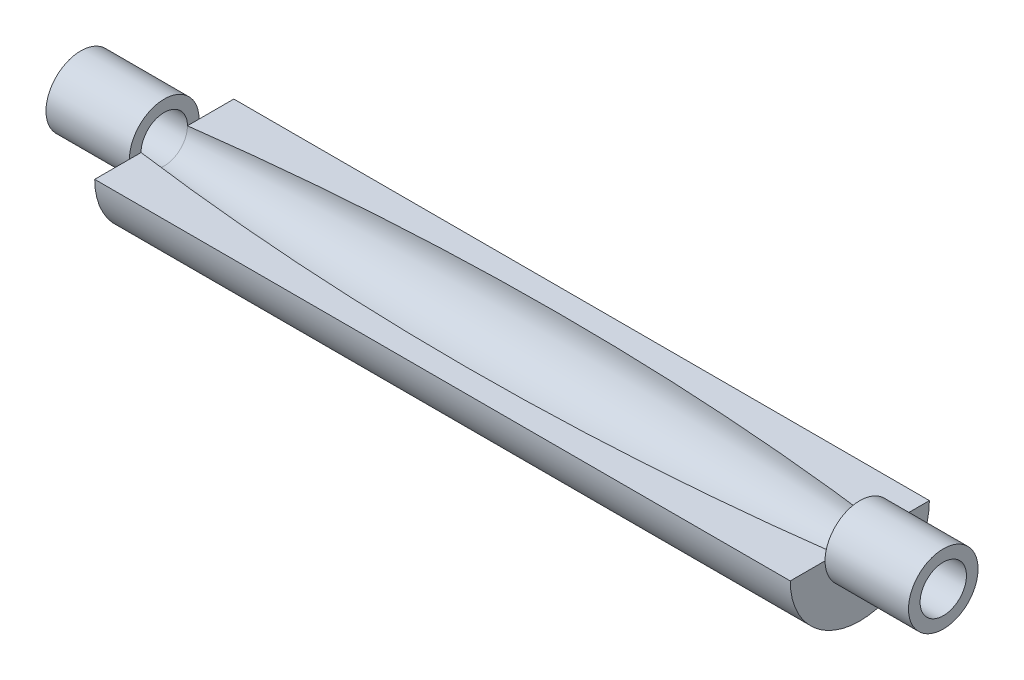
ISO-10303-21;
HEADER;
FILE_DESCRIPTION(('STEP AP214'),'2;1');
FILE_NAME('part.step','',(''),(''),'','','');
FILE_SCHEMA(('AUTOMOTIVE_DESIGN { 1 0 10303 214 1 1 1 1 }'));
ENDSEC;
DATA;
#1=APPLICATION_CONTEXT('core data for automotive mechanical design processes');
#2=APPLICATION_PROTOCOL_DEFINITION('international standard','automotive_design',2000,#1);
#3=PRODUCT_CONTEXT('',#1,'mechanical');
#4=PRODUCT('Part','Part','',(#3));
#5=PRODUCT_RELATED_PRODUCT_CATEGORY('part','',(#4));
#6=PRODUCT_DEFINITION_FORMATION('','',#4);
#7=PRODUCT_DEFINITION_CONTEXT('part definition',#1,'design');
#8=PRODUCT_DEFINITION('design','',#6,#7);
#9=PRODUCT_DEFINITION_SHAPE('','',#8);
#10=(LENGTH_UNIT() NAMED_UNIT(*) SI_UNIT(.MILLI.,.METRE.));
#11=(NAMED_UNIT(*) PLANE_ANGLE_UNIT() SI_UNIT($,.RADIAN.));
#12=(NAMED_UNIT(*) SI_UNIT($,.STERADIAN.) SOLID_ANGLE_UNIT());
#13=UNCERTAINTY_MEASURE_WITH_UNIT(LENGTH_MEASURE(1.E-05),#10,'distance_accuracy_value','');
#14=(GEOMETRIC_REPRESENTATION_CONTEXT(3) GLOBAL_UNCERTAINTY_ASSIGNED_CONTEXT((#13)) GLOBAL_UNIT_ASSIGNED_CONTEXT((#10,
#11,#12)) REPRESENTATION_CONTEXT('',''));
#15=CARTESIAN_POINT('',(0.,0.,0.));
#16=DIRECTION('',(0.,0.,1.));
#17=DIRECTION('',(1.,0.,0.));
#18=AXIS2_PLACEMENT_3D('',#15,#16,#17);
#19=CARTESIAN_POINT('',(-2.08166817117217E-13,-7.75108857223173E-12,1110.));
#20=DIRECTION('',(0.,-1.,0.));
#21=DIRECTION('',(0.,0.,-1.));
#22=AXIS2_PLACEMENT_3D('',#19,#20,#21);
#23=PLANE('',#22);
#24=DIRECTION('',(0.,0.,1.));
#25=VECTOR('',#24,1.);
#26=CARTESIAN_POINT('',(150.,-7.75108857223173E-12,1110.));
#27=LINE('',#26,#25);
#28=CARTESIAN_POINT('',(150.,0.,-15.));
#29=VERTEX_POINT('',#28);
#30=CARTESIAN_POINT('',(150.,0.,-9.99999999999999));
#31=VERTEX_POINT('',#30);
#32=EDGE_CURVE('E98',#29,#31,#27,.T.);
#33=ORIENTED_EDGE('',*,*,#32,.F.);
#34=DIRECTION('',(0.,0.,1.));
#35=VECTOR('',#34,1.);
#36=CARTESIAN_POINT('',(150.,2.09488880330588E-13,-29.9999999999999));
#37=LINE('',#36,#35);
#38=CARTESIAN_POINT('',(150.,2.09488880330588E-13,-29.9999999999999));
#39=VERTEX_POINT('',#38);
#40=EDGE_CURVE('E139',#39,#29,#37,.T.);
#41=ORIENTED_EDGE('',*,*,#40,.F.);
#42=DIRECTION('',(1.,0.,0.));
#43=VECTOR('',#42,1.);
#44=CARTESIAN_POINT('',(-150.,2.09488880330588E-13,-30.));
#45=LINE('',#44,#43);
#46=CARTESIAN_POINT('',(-150.,2.09488880330588E-13,-30.));
#47=VERTEX_POINT('',#46);
#48=EDGE_CURVE('E145',#47,#39,#45,.T.);
#49=ORIENTED_EDGE('',*,*,#48,.F.);
#50=DIRECTION('',(0.,0.,-1.));
#51=VECTOR('',#50,1.);
#52=CARTESIAN_POINT('',(-150.,1.04744440165294E-13,-15.));
#53=LINE('',#52,#51);
#54=CARTESIAN_POINT('',(-150.,1.04744440165294E-13,-15.));
#55=VERTEX_POINT('',#54);
#56=EDGE_CURVE('E230',#55,#47,#53,.T.);
#57=ORIENTED_EDGE('',*,*,#56,.F.);
#58=DIRECTION('',(0.,0.,-1.));
#59=VECTOR('',#58,1.);
#60=CARTESIAN_POINT('',(-150.,-7.75108857223173E-12,1110.));
#61=LINE('',#60,#59);
#62=CARTESIAN_POINT('',(-150.,0.,-9.99999999999999));
#63=VERTEX_POINT('',#62);
#64=EDGE_CURVE('E135',#63,#55,#61,.T.);
#65=ORIENTED_EDGE('',*,*,#64,.F.);
#66=CARTESIAN_POINT('',(-2.08166817117217E-13,-7.75108857223173E-12,1110.));
#67=DIRECTION('',(0.,1.,0.));
#68=DIRECTION('',(0.,0.,-1.));
#69=AXIS2_PLACEMENT_3D('',#66,#67,#68);
#70=CIRCLE('',#69,1130.);
#71=EDGE_CURVE('E125',#31,#63,#70,.T.);
#72=ORIENTED_EDGE('',*,*,#71,.F.);
#73=EDGE_LOOP('',(#33,#41,#49,#57,#65,#72));
#74=FACE_BOUND('',#73,.T.);
#75=ADVANCED_FACE('F43',(#74),#23,.F.);
#76=CARTESIAN_POINT('',(-2.08166817117217E-13,0.,-1110.));
#77=DIRECTION('',(0.,1.,0.));
#78=DIRECTION('',(0.,0.,1.));
#79=AXIS2_PLACEMENT_3D('',#76,#77,#78);
#80=PLANE('',#79);
#81=DIRECTION('',(0.,0.,-1.));
#82=VECTOR('',#81,1.);
#83=CARTESIAN_POINT('',(150.,0.,29.9999999999999));
#84=LINE('',#83,#82);
#85=CARTESIAN_POINT('',(150.,0.,29.9999999999999));
#86=VERTEX_POINT('',#85);
#87=CARTESIAN_POINT('',(150.,0.,15.));
#88=VERTEX_POINT('',#87);
#89=EDGE_CURVE('E223',#86,#88,#84,.T.);
#90=ORIENTED_EDGE('',*,*,#89,.T.);
#91=DIRECTION('',(0.,0.,-1.));
#92=VECTOR('',#91,1.);
#93=CARTESIAN_POINT('',(150.,0.,-1110.));
#94=LINE('',#93,#92);
#95=CARTESIAN_POINT('',(150.,0.,10.));
#96=VERTEX_POINT('',#95);
#97=EDGE_CURVE('E111',#88,#96,#94,.T.);
#98=ORIENTED_EDGE('',*,*,#97,.T.);
#99=CARTESIAN_POINT('',(-2.08166817117217E-13,0.,-1110.));
#100=DIRECTION('',(0.,-1.,0.));
#101=DIRECTION('',(0.,0.,1.));
#102=AXIS2_PLACEMENT_3D('',#99,#100,#101);
#103=CIRCLE('',#102,1130.);
#104=CARTESIAN_POINT('',(-150.,0.,10.));
#105=VERTEX_POINT('',#104);
#106=EDGE_CURVE('E127',#96,#105,#103,.T.);
#107=ORIENTED_EDGE('',*,*,#106,.T.);
#108=DIRECTION('',(0.,0.,1.));
#109=VECTOR('',#108,1.);
#110=CARTESIAN_POINT('',(-150.,0.,-1110.));
#111=LINE('',#110,#109);
#112=CARTESIAN_POINT('',(-150.,0.,15.));
#113=VERTEX_POINT('',#112);
#114=EDGE_CURVE('E11',#105,#113,#111,.T.);
#115=ORIENTED_EDGE('',*,*,#114,.T.);
#116=DIRECTION('',(0.,0.,1.));
#117=VECTOR('',#116,1.);
#118=CARTESIAN_POINT('',(-150.,0.,15.));
#119=LINE('',#118,#117);
#120=CARTESIAN_POINT('',(-150.,0.,30.));
#121=VERTEX_POINT('',#120);
#122=EDGE_CURVE('E224',#113,#121,#119,.T.);
#123=ORIENTED_EDGE('',*,*,#122,.T.);
#124=DIRECTION('',(1.,0.,0.));
#125=VECTOR('',#124,1.);
#126=CARTESIAN_POINT('',(-150.,0.,30.));
#127=LINE('',#126,#125);
#128=EDGE_CURVE('E219',#121,#86,#127,.T.);
#129=ORIENTED_EDGE('',*,*,#128,.T.);
#130=EDGE_LOOP('',(#90,#98,#107,#115,#123,#129));
#131=FACE_BOUND('',#130,.T.);
#132=ADVANCED_FACE('F184',(#131),#80,.T.);
#133=CARTESIAN_POINT('',(-186.,0.,-10.));
#134=DIRECTION('',(-1.,0.,0.));
#135=DIRECTION('',(0.,0.,1.));
#136=AXIS2_PLACEMENT_3D('',#133,#134,#135);
#137=PLANE('',#136);
#138=CARTESIAN_POINT('',(-186.,0.,0.));
#139=DIRECTION('',(-1.,0.,0.));
#140=DIRECTION('',(0.,0.,1.));
#141=AXIS2_PLACEMENT_3D('',#138,#139,#140);
#142=CIRCLE('',#141,15.);
#143=CARTESIAN_POINT('',(-186.,0.,15.));
#144=VERTEX_POINT('',#143);
#145=EDGE_CURVE('E52',#144,#144,#142,.T.);
#146=ORIENTED_EDGE('',*,*,#145,.T.);
#147=EDGE_LOOP('',(#146));
#148=FACE_BOUND('',#147,.T.);
#149=CARTESIAN_POINT('',(-186.,0.,0.));
#150=DIRECTION('',(-1.,0.,0.));
#151=DIRECTION('',(0.,0.,1.));
#152=AXIS2_PLACEMENT_3D('',#149,#150,#151);
#153=CIRCLE('',#152,10.);
#154=CARTESIAN_POINT('',(-186.,0.,10.));
#155=VERTEX_POINT('',#154);
#156=EDGE_CURVE('E138',#155,#155,#153,.T.);
#157=ORIENTED_EDGE('',*,*,#156,.F.);
#158=EDGE_LOOP('',(#157));
#159=FACE_BOUND('',#158,.T.);
#160=ADVANCED_FACE('F172',(#148,#159),#137,.T.);
#161=CARTESIAN_POINT('',(-186.,0.,0.));
#162=DIRECTION('',(-1.,0.,0.));
#163=DIRECTION('',(0.,0.,1.));
#164=AXIS2_PLACEMENT_3D('',#161,#162,#163);
#165=CYLINDRICAL_SURFACE('',#164,15.);
#166=CARTESIAN_POINT('',(-150.,0.,0.));
#167=DIRECTION('',(-1.,0.,0.));
#168=DIRECTION('',(0.,0.,1.));
#169=AXIS2_PLACEMENT_3D('',#166,#167,#168);
#170=CIRCLE('',#169,15.);
#171=EDGE_CURVE('E110',#113,#55,#170,.T.);
#172=ORIENTED_EDGE('',*,*,#171,.T.);
#173=CARTESIAN_POINT('',(-150.,0.,0.));
#174=DIRECTION('',(-1.,0.,0.));
#175=DIRECTION('',(0.,0.,1.));
#176=AXIS2_PLACEMENT_3D('',#173,#174,#175);
#177=CIRCLE('',#176,15.);
#178=EDGE_CURVE('E165',#55,#113,#177,.T.);
#179=ORIENTED_EDGE('',*,*,#178,.T.);
#180=EDGE_LOOP('',(#172,#179));
#181=FACE_BOUND('',#180,.T.);
#182=ORIENTED_EDGE('',*,*,#145,.F.);
#183=EDGE_LOOP('',(#182));
#184=FACE_BOUND('',#183,.T.);
#185=ADVANCED_FACE('F45',(#181,#184),#165,.T.);
#186=CARTESIAN_POINT('',(-150.,1.04744440165294E-13,-15.));
#187=DIRECTION('',(-1.,0.,0.));
#188=DIRECTION('',(0.,0.,1.));
#189=AXIS2_PLACEMENT_3D('',#186,#187,#188);
#190=PLANE('',#189);
#191=CARTESIAN_POINT('',(-150.,0.,0.));
#192=DIRECTION('',(-1.,0.,0.));
#193=DIRECTION('',(0.,0.,1.));
#194=AXIS2_PLACEMENT_3D('',#191,#192,#193);
#195=CIRCLE('',#194,30.);
#196=EDGE_CURVE('E66',#47,#121,#195,.T.);
#197=ORIENTED_EDGE('',*,*,#196,.T.);
#198=ORIENTED_EDGE('',*,*,#122,.F.);
#199=ORIENTED_EDGE('',*,*,#178,.F.);
#200=ORIENTED_EDGE('',*,*,#56,.T.);
#201=EDGE_LOOP('',(#197,#198,#199,#200));
#202=FACE_BOUND('',#201,.T.);
#203=ADVANCED_FACE('F176',(#202),#190,.T.);
#204=CARTESIAN_POINT('',(-186.,0.,0.));
#205=DIRECTION('',(-1.,0.,0.));
#206=DIRECTION('',(0.,0.,1.));
#207=AXIS2_PLACEMENT_3D('',#204,#205,#206);
#208=CYLINDRICAL_SURFACE('',#207,30.);
#209=CARTESIAN_POINT('',(150.,0.,0.));
#210=DIRECTION('',(-1.,0.,0.));
#211=DIRECTION('',(0.,0.,1.));
#212=AXIS2_PLACEMENT_3D('',#209,#210,#211);
#213=CIRCLE('',#212,29.9999999999999);
#214=EDGE_CURVE('E59',#39,#86,#213,.T.);
#215=ORIENTED_EDGE('',*,*,#214,.T.);
#216=ORIENTED_EDGE('',*,*,#128,.F.);
#217=ORIENTED_EDGE('',*,*,#196,.F.);
#218=ORIENTED_EDGE('',*,*,#48,.T.);
#219=EDGE_LOOP('',(#215,#216,#217,#218));
#220=FACE_BOUND('',#219,.T.);
#221=ADVANCED_FACE('F182',(#220),#208,.T.);
#222=CARTESIAN_POINT('',(150.,2.09488880330588E-13,-29.9999999999999));
#223=DIRECTION('',(1.,0.,0.));
#224=DIRECTION('',(0.,0.,-1.));
#225=AXIS2_PLACEMENT_3D('',#222,#223,#224);
#226=PLANE('',#225);
#227=CARTESIAN_POINT('',(150.,0.,0.));
#228=DIRECTION('',(-1.,0.,0.));
#229=DIRECTION('',(0.,0.,1.));
#230=AXIS2_PLACEMENT_3D('',#227,#228,#229);
#231=CIRCLE('',#230,15.);
#232=EDGE_CURVE('E158',#29,#88,#231,.T.);
#233=ORIENTED_EDGE('',*,*,#232,.T.);
#234=ORIENTED_EDGE('',*,*,#89,.F.);
#235=ORIENTED_EDGE('',*,*,#214,.F.);
#236=ORIENTED_EDGE('',*,*,#40,.T.);
#237=EDGE_LOOP('',(#233,#234,#235,#236));
#238=FACE_BOUND('',#237,.T.);
#239=ADVANCED_FACE('F211',(#238),#226,.T.);
#240=CARTESIAN_POINT('',(-186.,0.,0.));
#241=DIRECTION('',(-1.,0.,0.));
#242=DIRECTION('',(0.,0.,1.));
#243=AXIS2_PLACEMENT_3D('',#240,#241,#242);
#244=CYLINDRICAL_SURFACE('',#243,15.);
#245=CARTESIAN_POINT('',(186.,0.,0.));
#246=DIRECTION('',(-1.,0.,0.));
#247=DIRECTION('',(0.,0.,1.));
#248=AXIS2_PLACEMENT_3D('',#245,#246,#247);
#249=CIRCLE('',#248,15.);
#250=CARTESIAN_POINT('',(186.,0.,15.));
#251=VERTEX_POINT('',#250);
#252=EDGE_CURVE('E154',#251,#251,#249,.T.);
#253=ORIENTED_EDGE('',*,*,#252,.T.);
#254=EDGE_LOOP('',(#253));
#255=FACE_BOUND('',#254,.T.);
#256=ORIENTED_EDGE('',*,*,#232,.F.);
#257=CARTESIAN_POINT('',(150.,0.,0.));
#258=DIRECTION('',(-1.,0.,0.));
#259=DIRECTION('',(0.,0.,1.));
#260=AXIS2_PLACEMENT_3D('',#257,#258,#259);
#261=CIRCLE('',#260,15.);
#262=EDGE_CURVE('E104',#88,#29,#261,.T.);
#263=ORIENTED_EDGE('',*,*,#262,.F.);
#264=EDGE_LOOP('',(#256,#263));
#265=FACE_BOUND('',#264,.T.);
#266=ADVANCED_FACE('F207',(#255,#265),#244,.T.);
#267=CARTESIAN_POINT('',(186.,1.04744440165294E-13,-15.));
#268=DIRECTION('',(1.,0.,0.));
#269=DIRECTION('',(0.,0.,-1.));
#270=AXIS2_PLACEMENT_3D('',#267,#268,#269);
#271=PLANE('',#270);
#272=CARTESIAN_POINT('',(186.,0.,0.));
#273=DIRECTION('',(-1.,0.,0.));
#274=DIRECTION('',(0.,0.,1.));
#275=AXIS2_PLACEMENT_3D('',#272,#273,#274);
#276=CIRCLE('',#275,10.);
#277=CARTESIAN_POINT('',(186.,0.,10.));
#278=VERTEX_POINT('',#277);
#279=EDGE_CURVE('E129',#278,#278,#276,.T.);
#280=ORIENTED_EDGE('',*,*,#279,.T.);
#281=EDGE_LOOP('',(#280));
#282=FACE_BOUND('',#281,.T.);
#283=ORIENTED_EDGE('',*,*,#252,.F.);
#284=EDGE_LOOP('',(#283));
#285=FACE_BOUND('',#284,.T.);
#286=ADVANCED_FACE('F204',(#282,#285),#271,.T.);
#287=CARTESIAN_POINT('',(-186.,0.,0.));
#288=DIRECTION('',(-1.,0.,0.));
#289=DIRECTION('',(0.,0.,1.));
#290=AXIS2_PLACEMENT_3D('',#287,#288,#289);
#291=CYLINDRICAL_SURFACE('',#290,10.);
#292=CARTESIAN_POINT('',(150.,0.,0.));
#293=DIRECTION('',(-1.,0.,0.));
#294=DIRECTION('',(0.,0.,1.));
#295=AXIS2_PLACEMENT_3D('',#292,#293,#294);
#296=CIRCLE('',#295,9.99999999999999);
#297=EDGE_CURVE('E102',#96,#31,#296,.T.);
#298=ORIENTED_EDGE('',*,*,#297,.T.);
#299=CARTESIAN_POINT('',(150.,0.,0.));
#300=DIRECTION('',(-1.,0.,0.));
#301=DIRECTION('',(0.,0.,1.));
#302=AXIS2_PLACEMENT_3D('',#299,#300,#301);
#303=CIRCLE('',#302,10.);
#304=EDGE_CURVE('E118',#31,#96,#303,.T.);
#305=ORIENTED_EDGE('',*,*,#304,.T.);
#306=EDGE_LOOP('',(#298,#305));
#307=FACE_BOUND('',#306,.T.);
#308=ORIENTED_EDGE('',*,*,#279,.F.);
#309=EDGE_LOOP('',(#308));
#310=FACE_BOUND('',#309,.T.);
#311=ADVANCED_FACE('F116',(#307,#310),#291,.F.);
#312=CARTESIAN_POINT('',(-2.08166817117217E-13,0.,0.));
#313=DIRECTION('',(-1.,0.,0.));
#314=DIRECTION('',(0.,0.,1.));
#315=AXIS2_PLACEMENT_3D('',#312,#313,#314);
#316=DEGENERATE_TOROIDAL_SURFACE('',#315,1110.,1130.,.F.);
#317=CARTESIAN_POINT('',(-150.,0.,0.));
#318=DIRECTION('',(-1.,0.,0.));
#319=DIRECTION('',(0.,0.,1.));
#320=AXIS2_PLACEMENT_3D('',#317,#318,#319);
#321=CIRCLE('',#320,10.);
#322=EDGE_CURVE('E130',#63,#105,#321,.T.);
#323=ORIENTED_EDGE('',*,*,#322,.T.);
#324=ORIENTED_EDGE('',*,*,#106,.F.);
#325=ORIENTED_EDGE('',*,*,#304,.F.);
#326=ORIENTED_EDGE('',*,*,#71,.T.);
#327=EDGE_LOOP('',(#323,#324,#325,#326));
#328=FACE_BOUND('',#327,.T.);
#329=ADVANCED_FACE('F124',(#328),#316,.T.);
#330=CARTESIAN_POINT('',(-186.,0.,0.));
#331=DIRECTION('',(-1.,0.,0.));
#332=DIRECTION('',(0.,0.,1.));
#333=AXIS2_PLACEMENT_3D('',#330,#331,#332);
#334=CYLINDRICAL_SURFACE('',#333,10.);
#335=ORIENTED_EDGE('',*,*,#156,.T.);
#336=EDGE_LOOP('',(#335));
#337=FACE_BOUND('',#336,.T.);
#338=ORIENTED_EDGE('',*,*,#322,.F.);
#339=CARTESIAN_POINT('',(-150.,0.,0.));
#340=DIRECTION('',(-1.,0.,0.));
#341=DIRECTION('',(0.,0.,1.));
#342=AXIS2_PLACEMENT_3D('',#339,#340,#341);
#343=CIRCLE('',#342,9.99999999999999);
#344=EDGE_CURVE('E242',#105,#63,#343,.T.);
#345=ORIENTED_EDGE('',*,*,#344,.F.);
#346=EDGE_LOOP('',(#338,#345));
#347=FACE_BOUND('',#346,.T.);
#348=ADVANCED_FACE('F195',(#337,#347),#334,.F.);
#349=CARTESIAN_POINT('',(-150.,15.,0.));
#350=DIRECTION('',(-1.,0.,0.));
#351=DIRECTION('',(0.,0.,1.));
#352=AXIS2_PLACEMENT_3D('',#349,#350,#351);
#353=PLANE('',#352);
#354=ORIENTED_EDGE('',*,*,#344,.T.);
#355=ORIENTED_EDGE('',*,*,#64,.T.);
#356=ORIENTED_EDGE('',*,*,#171,.F.);
#357=ORIENTED_EDGE('',*,*,#114,.F.);
#358=EDGE_LOOP('',(#354,#355,#356,#357));
#359=FACE_BOUND('',#358,.T.);
#360=ADVANCED_FACE('F198',(#359),#353,.F.);
#361=CARTESIAN_POINT('',(150.,15.,0.));
#362=DIRECTION('',(1.,0.,0.));
#363=DIRECTION('',(0.,0.,1.));
#364=AXIS2_PLACEMENT_3D('',#361,#362,#363);
#365=PLANE('',#364);
#366=ORIENTED_EDGE('',*,*,#262,.T.);
#367=ORIENTED_EDGE('',*,*,#32,.T.);
#368=ORIENTED_EDGE('',*,*,#297,.F.);
#369=ORIENTED_EDGE('',*,*,#97,.F.);
#370=EDGE_LOOP('',(#366,#367,#368,#369));
#371=FACE_BOUND('',#370,.T.);
#372=ADVANCED_FACE('F100',(#371),#365,.F.);
#373=CLOSED_SHELL('',(#75,#132,#160,#185,#203,#221,#239,#266,#286,#311,#329,#348,#360,#372));
#374=MANIFOLD_SOLID_BREP('B2',#373);
#375=ADVANCED_BREP_SHAPE_REPRESENTATION('',(#18,#374),#14);
#376=SHAPE_DEFINITION_REPRESENTATION(#9,#375);
ENDSEC;
END-ISO-10303-21;
